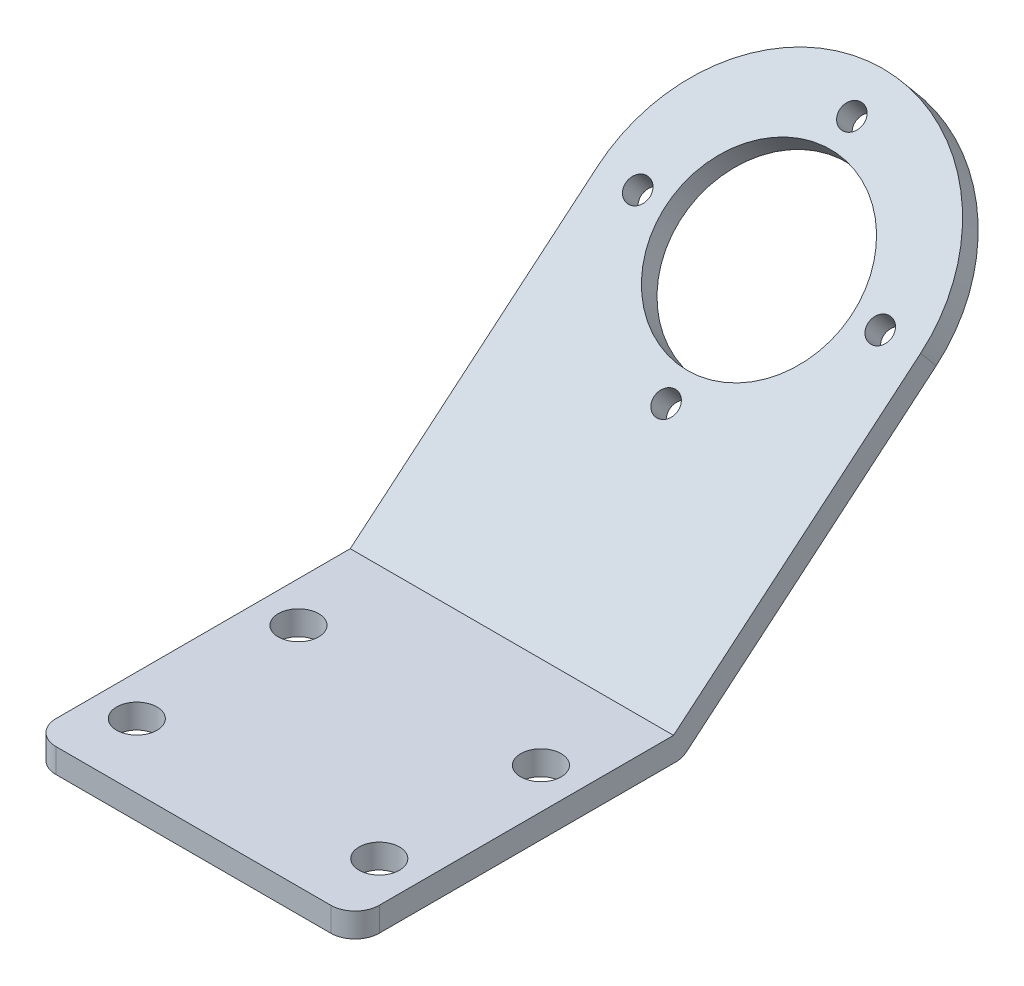
ISO-10303-21;
HEADER;
FILE_DESCRIPTION(('STEP AP214'),'2;1');
FILE_NAME('part.step','',(''),(''),'','','');
FILE_SCHEMA(('AUTOMOTIVE_DESIGN { 1 0 10303 214 1 1 1 1 }'));
ENDSEC;
DATA;
#1=APPLICATION_CONTEXT('core data for automotive mechanical design processes');
#2=APPLICATION_PROTOCOL_DEFINITION('international standard','automotive_design',2000,#1);
#3=PRODUCT_CONTEXT('',#1,'mechanical');
#4=PRODUCT('Part','Part','',(#3));
#5=PRODUCT_RELATED_PRODUCT_CATEGORY('part','',(#4));
#6=PRODUCT_DEFINITION_FORMATION('','',#4);
#7=PRODUCT_DEFINITION_CONTEXT('part definition',#1,'design');
#8=PRODUCT_DEFINITION('design','',#6,#7);
#9=PRODUCT_DEFINITION_SHAPE('','',#8);
#10=(LENGTH_UNIT() NAMED_UNIT(*) SI_UNIT(.MILLI.,.METRE.));
#11=(NAMED_UNIT(*) PLANE_ANGLE_UNIT() SI_UNIT($,.RADIAN.));
#12=(NAMED_UNIT(*) SI_UNIT($,.STERADIAN.) SOLID_ANGLE_UNIT());
#13=UNCERTAINTY_MEASURE_WITH_UNIT(LENGTH_MEASURE(1.E-05),#10,'distance_accuracy_value','');
#14=(GEOMETRIC_REPRESENTATION_CONTEXT(3) GLOBAL_UNCERTAINTY_ASSIGNED_CONTEXT((#13)) GLOBAL_UNIT_ASSIGNED_CONTEXT((#10,
#11,#12)) REPRESENTATION_CONTEXT('',''));
#15=CARTESIAN_POINT('',(0.,0.,0.));
#16=DIRECTION('',(0.,0.,1.));
#17=DIRECTION('',(1.,0.,0.));
#18=AXIS2_PLACEMENT_3D('',#15,#16,#17);
#19=CARTESIAN_POINT('',(40.,0.,39.4080892972013));
#20=DIRECTION('',(0.,0.,-1.));
#21=DIRECTION('',(-1.,0.,0.));
#22=AXIS2_PLACEMENT_3D('',#19,#20,#21);
#23=PLANE('',#22);
#24=DIRECTION('',(-1.,0.,0.));
#25=VECTOR('',#24,1.);
#26=CARTESIAN_POINT('',(40.,0.,39.4080892972013));
#27=LINE('',#26,#25);
#28=CARTESIAN_POINT('',(37.,0.,39.4080892972013));
#29=VERTEX_POINT('',#28);
#30=CARTESIAN_POINT('',(3.,0.,39.4080892972013));
#31=VERTEX_POINT('',#30);
#32=EDGE_CURVE('E141',#29,#31,#27,.T.);
#33=ORIENTED_EDGE('',*,*,#32,.T.);
#34=DIRECTION('',(0.,-1.,0.));
#35=VECTOR('',#34,1.);
#36=CARTESIAN_POINT('',(3.,0.,39.4080892972013));
#37=LINE('',#36,#35);
#38=CARTESIAN_POINT('',(3.,-3.,39.4080892972013));
#39=VERTEX_POINT('',#38);
#40=EDGE_CURVE('E181',#31,#39,#37,.T.);
#41=ORIENTED_EDGE('',*,*,#40,.T.);
#42=DIRECTION('',(-1.,0.,0.));
#43=VECTOR('',#42,1.);
#44=CARTESIAN_POINT('',(40.,-3.,39.4080892972013));
#45=LINE('',#44,#43);
#46=CARTESIAN_POINT('',(37.,-3.,39.4080892972013));
#47=VERTEX_POINT('',#46);
#48=EDGE_CURVE('E140',#47,#39,#45,.T.);
#49=ORIENTED_EDGE('',*,*,#48,.F.);
#50=DIRECTION('',(0.,-1.,0.));
#51=VECTOR('',#50,1.);
#52=CARTESIAN_POINT('',(37.,0.,39.4080892972013));
#53=LINE('',#52,#51);
#54=EDGE_CURVE('E176',#47,#29,#53,.F.);
#55=ORIENTED_EDGE('',*,*,#54,.T.);
#56=EDGE_LOOP('',(#33,#41,#49,#55));
#57=FACE_BOUND('',#56,.T.);
#58=ADVANCED_FACE('F39',(#57),#23,.F.);
#59=CARTESIAN_POINT('',(40.,-3.,-1.09191070279867));
#60=DIRECTION('',(0.,1.,0.));
#61=DIRECTION('',(0.,0.,1.));
#62=AXIS2_PLACEMENT_3D('',#59,#60,#61);
#63=PLANE('',#62);
#64=CARTESIAN_POINT('',(35.,-3.,31.4080892972013));
#65=DIRECTION('',(0.,1.,0.));
#66=DIRECTION('',(0.,0.,1.));
#67=AXIS2_PLACEMENT_3D('',#64,#65,#66);
#68=CIRCLE('',#67,2.5);
#69=CARTESIAN_POINT('',(35.,-3.,33.9080892972013));
#70=VERTEX_POINT('',#69);
#71=EDGE_CURVE('E302',#70,#70,#68,.T.);
#72=ORIENTED_EDGE('',*,*,#71,.T.);
#73=EDGE_LOOP('',(#72));
#74=FACE_BOUND('',#73,.T.);
#75=CARTESIAN_POINT('',(35.,-3.,11.4080892972013));
#76=DIRECTION('',(0.,1.,0.));
#77=DIRECTION('',(0.,0.,1.));
#78=AXIS2_PLACEMENT_3D('',#75,#76,#77);
#79=CIRCLE('',#78,2.49999999895199);
#80=CARTESIAN_POINT('',(35.,-3.,13.9080892961533));
#81=VERTEX_POINT('',#80);
#82=EDGE_CURVE('E294',#81,#81,#79,.T.);
#83=ORIENTED_EDGE('',*,*,#82,.T.);
#84=EDGE_LOOP('',(#83));
#85=FACE_BOUND('',#84,.T.);
#86=CARTESIAN_POINT('',(5.,-3.,11.4080892972013));
#87=DIRECTION('',(0.,1.,0.));
#88=DIRECTION('',(0.,0.,1.));
#89=AXIS2_PLACEMENT_3D('',#86,#87,#88);
#90=CIRCLE('',#89,2.49999999895199);
#91=CARTESIAN_POINT('',(5.,-3.,13.9080892961533));
#92=VERTEX_POINT('',#91);
#93=EDGE_CURVE('E286',#92,#92,#90,.T.);
#94=ORIENTED_EDGE('',*,*,#93,.T.);
#95=EDGE_LOOP('',(#94));
#96=FACE_BOUND('',#95,.T.);
#97=CARTESIAN_POINT('',(5.,-3.,31.4080892972013));
#98=DIRECTION('',(0.,1.,0.));
#99=DIRECTION('',(0.,0.,1.));
#100=AXIS2_PLACEMENT_3D('',#97,#98,#99);
#101=CIRCLE('',#100,2.5);
#102=CARTESIAN_POINT('',(5.,-3.,33.9080892972013));
#103=VERTEX_POINT('',#102);
#104=EDGE_CURVE('E158',#103,#103,#101,.T.);
#105=ORIENTED_EDGE('',*,*,#104,.T.);
#106=EDGE_LOOP('',(#105));
#107=FACE_BOUND('',#106,.T.);
#108=DIRECTION('',(0.,0.,-1.));
#109=VECTOR('',#108,1.);
#110=CARTESIAN_POINT('',(0.,-3.,-1.09191070279867));
#111=LINE('',#110,#109);
#112=CARTESIAN_POINT('',(0.,-3.,36.4080892972013));
#113=VERTEX_POINT('',#112);
#114=CARTESIAN_POINT('',(0.,-3.,-0.363970234266271));
#115=VERTEX_POINT('',#114);
#116=EDGE_CURVE('E154',#113,#115,#111,.T.);
#117=ORIENTED_EDGE('',*,*,#116,.T.);
#118=DIRECTION('',(-1.,0.,0.));
#119=VECTOR('',#118,1.);
#120=CARTESIAN_POINT('',(40.,-3.,-0.363970234266271));
#121=LINE('',#120,#119);
#122=CARTESIAN_POINT('',(40.,-3.,-0.363970234266271));
#123=VERTEX_POINT('',#122);
#124=EDGE_CURVE('E48',#115,#123,#121,.F.);
#125=ORIENTED_EDGE('',*,*,#124,.T.);
#126=DIRECTION('',(0.,0.,-1.));
#127=VECTOR('',#126,1.);
#128=CARTESIAN_POINT('',(40.,-3.,39.4080892972013));
#129=LINE('',#128,#127);
#130=CARTESIAN_POINT('',(40.,-3.,36.4080892972013));
#131=VERTEX_POINT('',#130);
#132=EDGE_CURVE('E165',#131,#123,#129,.T.);
#133=ORIENTED_EDGE('',*,*,#132,.F.);
#134=CARTESIAN_POINT('',(37.,-3.,36.4080892972013));
#135=DIRECTION('',(0.,1.,0.));
#136=DIRECTION('',(0.,0.,1.));
#137=AXIS2_PLACEMENT_3D('',#134,#135,#136);
#138=CIRCLE('',#137,3.);
#139=EDGE_CURVE('E173',#131,#47,#138,.F.);
#140=ORIENTED_EDGE('',*,*,#139,.T.);
#141=ORIENTED_EDGE('',*,*,#48,.T.);
#142=CARTESIAN_POINT('',(3.,-3.,36.4080892972013));
#143=DIRECTION('',(0.,1.,0.));
#144=DIRECTION('',(0.,0.,1.));
#145=AXIS2_PLACEMENT_3D('',#142,#143,#144);
#146=CIRCLE('',#145,3.);
#147=EDGE_CURVE('E185',#39,#113,#146,.F.);
#148=ORIENTED_EDGE('',*,*,#147,.T.);
#149=EDGE_LOOP('',(#117,#125,#133,#140,#141,#148));
#150=FACE_BOUND('',#149,.T.);
#151=ADVANCED_FACE('F251',(#74,#85,#96,#107,#150),#63,.F.);
#152=CARTESIAN_POINT('',(40.,36.210044190879,-47.8206217330563));
#153=DIRECTION('',(0.,0.766044443118977,0.64278760968654));
#154=DIRECTION('',(0.,-0.64278760968654,0.766044443118977));
#155=AXIS2_PLACEMENT_3D('',#152,#153,#154);
#156=PLANE('',#155);
#157=CARTESIAN_POINT('',(20.,13.7124778518501,-21.0090662238921));
#158=DIRECTION('',(0.,0.766044443118977,0.64278760968654));
#159=DIRECTION('',(0.,-0.64278760968654,0.766044443118977));
#160=AXIS2_PLACEMENT_3D('',#157,#158,#159);
#161=CIRCLE('',#160,1.5);
#162=CARTESIAN_POINT('',(20.,12.7482964373203,-19.8599995592136));
#163=VERTEX_POINT('',#162);
#164=EDGE_CURVE('E342',#163,#163,#161,.T.);
#165=ORIENTED_EDGE('',*,*,#164,.T.);
#166=EDGE_LOOP('',(#165));
#167=FACE_BOUND('',#166,.T.);
#168=CARTESIAN_POINT('',(5.00000000000002,23.3542919971482,-32.4997328706767));
#169=DIRECTION('',(0.,0.766044443118977,0.64278760968654));
#170=DIRECTION('',(0.,-0.64278760968654,0.766044443118977));
#171=AXIS2_PLACEMENT_3D('',#168,#169,#170);
#172=CIRCLE('',#171,1.5);
#173=CARTESIAN_POINT('',(5.00000000000002,22.3901105826183,-31.3506662059983));
#174=VERTEX_POINT('',#173);
#175=EDGE_CURVE('E334',#174,#174,#172,.T.);
#176=ORIENTED_EDGE('',*,*,#175,.T.);
#177=EDGE_LOOP('',(#176));
#178=FACE_BOUND('',#177,.T.);
#179=CARTESIAN_POINT('',(35.,23.3542919971482,-32.4997328706767));
#180=DIRECTION('',(0.,0.766044443118977,0.64278760968654));
#181=DIRECTION('',(0.,-0.64278760968654,0.766044443118977));
#182=AXIS2_PLACEMENT_3D('',#179,#180,#181);
#183=CIRCLE('',#182,1.50000000000001);
#184=CARTESIAN_POINT('',(35.,22.3901105826183,-31.3506662059983));
#185=VERTEX_POINT('',#184);
#186=EDGE_CURVE('E326',#185,#185,#183,.T.);
#187=ORIENTED_EDGE('',*,*,#186,.T.);
#188=EDGE_LOOP('',(#187));
#189=FACE_BOUND('',#188,.T.);
#190=CARTESIAN_POINT('',(20.,32.9961061424462,-43.9903995174614));
#191=DIRECTION('',(0.,0.766044443118977,0.64278760968654));
#192=DIRECTION('',(0.,-0.64278760968654,0.766044443118977));
#193=AXIS2_PLACEMENT_3D('',#190,#191,#192);
#194=CIRCLE('',#193,1.5);
#195=CARTESIAN_POINT('',(20.,32.0319247279164,-42.8413328527829));
#196=VERTEX_POINT('',#195);
#197=EDGE_CURVE('E318',#196,#196,#194,.T.);
#198=ORIENTED_EDGE('',*,*,#197,.T.);
#199=EDGE_LOOP('',(#198));
#200=FACE_BOUND('',#199,.T.);
#201=CARTESIAN_POINT('',(20.,23.3542919971482,-32.4997328706767));
#202=DIRECTION('',(0.,0.766044443118977,0.64278760968654));
#203=DIRECTION('',(0.,-0.64278760968654,0.766044443118977));
#204=AXIS2_PLACEMENT_3D('',#201,#202,#203);
#205=CIRCLE('',#204,11.55);
#206=CARTESIAN_POINT('',(20.,15.9300951052686,-23.6519195526525));
#207=VERTEX_POINT('',#206);
#208=EDGE_CURVE('E310',#207,#207,#205,.T.);
#209=ORIENTED_EDGE('',*,*,#208,.T.);
#210=EDGE_LOOP('',(#209));
#211=FACE_BOUND('',#210,.T.);
#212=DIRECTION('',(0.,0.64278760968654,-0.766044443118977));
#213=VECTOR('',#212,1.);
#214=CARTESIAN_POINT('',(40.,36.210044190879,-47.8206217330563));
#215=LINE('',#214,#213);
#216=CARTESIAN_POINT('',(40.,-2.53208888623795,-1.64954545363936));
#217=VERTEX_POINT('',#216);
#218=CARTESIAN_POINT('',(40.,23.3542919971482,-32.4997328706767));
#219=VERTEX_POINT('',#218);
#220=EDGE_CURVE('E129',#217,#219,#215,.T.);
#221=ORIENTED_EDGE('',*,*,#220,.F.);
#222=DIRECTION('',(-1.,0.,0.));
#223=VECTOR('',#222,1.);
#224=CARTESIAN_POINT('',(40.,-2.53208888623796,-1.64954545363934));
#225=LINE('',#224,#223);
#226=CARTESIAN_POINT('',(0.,-2.53208888623795,-1.64954545363936));
#227=VERTEX_POINT('',#226);
#228=EDGE_CURVE('E217',#217,#227,#225,.T.);
#229=ORIENTED_EDGE('',*,*,#228,.T.);
#230=DIRECTION('',(0.,0.64278760968654,-0.766044443118977));
#231=VECTOR('',#230,1.);
#232=CARTESIAN_POINT('',(0.,36.210044190879,-47.8206217330563));
#233=LINE('',#232,#231);
#234=CARTESIAN_POINT('',(0.,23.3542919971482,-32.4997328706767));
#235=VERTEX_POINT('',#234);
#236=EDGE_CURVE('E157',#227,#235,#233,.T.);
#237=ORIENTED_EDGE('',*,*,#236,.T.);
#238=CARTESIAN_POINT('',(20.,23.3542919971482,-32.4997328706767));
#239=DIRECTION('',(0.,0.766044443118977,0.64278760968654));
#240=DIRECTION('',(0.,-0.64278760968654,0.766044443118977));
#241=AXIS2_PLACEMENT_3D('',#238,#239,#240);
#242=CIRCLE('',#241,20.);
#243=CARTESIAN_POINT('',(20.,36.210044190879,-47.8206217330563));
#244=VERTEX_POINT('',#243);
#245=EDGE_CURVE('E205',#235,#244,#242,.F.);
#246=ORIENTED_EDGE('',*,*,#245,.T.);
#247=CARTESIAN_POINT('',(20.,23.3542919971482,-32.4997328706767));
#248=DIRECTION('',(0.,0.766044443118977,0.64278760968654));
#249=DIRECTION('',(0.,-0.64278760968654,0.766044443118977));
#250=AXIS2_PLACEMENT_3D('',#247,#248,#249);
#251=CIRCLE('',#250,20.);
#252=EDGE_CURVE('E213',#244,#219,#251,.F.);
#253=ORIENTED_EDGE('',*,*,#252,.T.);
#254=EDGE_LOOP('',(#221,#229,#237,#246,#253));
#255=FACE_BOUND('',#254,.T.);
#256=ADVANCED_FACE('F226',(#167,#178,#189,#200,#211,#255),#156,.F.);
#257=CARTESIAN_POINT('',(40.,0.,0.));
#258=DIRECTION('',(0.,-0.766044443118977,-0.64278760968654));
#259=DIRECTION('',(0.,0.64278760968654,-0.766044443118977));
#260=AXIS2_PLACEMENT_3D('',#257,#258,#259);
#261=PLANE('',#260);
#262=CARTESIAN_POINT('',(20.,16.010611181207,-19.0807033948324));
#263=DIRECTION('',(0.,0.766044443118977,0.64278760968654));
#264=DIRECTION('',(0.,0.64278760968654,-0.766044443118977));
#265=AXIS2_PLACEMENT_3D('',#262,#263,#264);
#266=CIRCLE('',#265,1.5);
#267=CARTESIAN_POINT('',(20.,16.9747925957368,-20.2297700595109));
#268=VERTEX_POINT('',#267);
#269=EDGE_CURVE('E346',#268,#268,#266,.T.);
#270=ORIENTED_EDGE('',*,*,#269,.F.);
#271=EDGE_LOOP('',(#270));
#272=FACE_BOUND('',#271,.T.);
#273=CARTESIAN_POINT('',(5.00000000000002,25.6524253265051,-30.5713700416171));
#274=DIRECTION('',(0.,0.766044443118977,0.64278760968654));
#275=DIRECTION('',(0.,-0.64278760968654,0.766044443118977));
#276=AXIS2_PLACEMENT_3D('',#273,#274,#275);
#277=CIRCLE('',#276,1.5);
#278=CARTESIAN_POINT('',(5.00000000000002,24.6882439119753,-29.4223033769386));
#279=VERTEX_POINT('',#278);
#280=EDGE_CURVE('E338',#279,#279,#277,.T.);
#281=ORIENTED_EDGE('',*,*,#280,.F.);
#282=EDGE_LOOP('',(#281));
#283=FACE_BOUND('',#282,.T.);
#284=CARTESIAN_POINT('',(35.,25.6524253265051,-30.5713700416171));
#285=DIRECTION('',(0.,0.766044443118977,0.64278760968654));
#286=DIRECTION('',(0.,0.64278760968654,-0.766044443118977));
#287=AXIS2_PLACEMENT_3D('',#284,#285,#286);
#288=CIRCLE('',#287,1.50000000000001);
#289=CARTESIAN_POINT('',(35.,26.6166067410349,-31.7204367062956));
#290=VERTEX_POINT('',#289);
#291=EDGE_CURVE('E330',#290,#290,#288,.T.);
#292=ORIENTED_EDGE('',*,*,#291,.F.);
#293=EDGE_LOOP('',(#292));
#294=FACE_BOUND('',#293,.T.);
#295=CARTESIAN_POINT('',(20.,35.2942394718032,-42.0620366884017));
#296=DIRECTION('',(0.,0.766044443118977,0.64278760968654));
#297=DIRECTION('',(0.,-0.64278760968654,0.766044443118977));
#298=AXIS2_PLACEMENT_3D('',#295,#296,#297);
#299=CIRCLE('',#298,1.5);
#300=CARTESIAN_POINT('',(20.,34.3300580572734,-40.9129700237233));
#301=VERTEX_POINT('',#300);
#302=EDGE_CURVE('E322',#301,#301,#299,.T.);
#303=ORIENTED_EDGE('',*,*,#302,.F.);
#304=EDGE_LOOP('',(#303));
#305=FACE_BOUND('',#304,.T.);
#306=CARTESIAN_POINT('',(20.,25.6524253265051,-30.5713700416171));
#307=DIRECTION('',(0.,0.766044443118977,0.64278760968654));
#308=DIRECTION('',(0.,-0.64278760968654,0.766044443118977));
#309=AXIS2_PLACEMENT_3D('',#306,#307,#308);
#310=CIRCLE('',#309,11.55);
#311=CARTESIAN_POINT('',(20.,18.2282284346256,-21.7235567235929));
#312=VERTEX_POINT('',#311);
#313=EDGE_CURVE('E314',#312,#312,#310,.T.);
#314=ORIENTED_EDGE('',*,*,#313,.F.);
#315=EDGE_LOOP('',(#314));
#316=FACE_BOUND('',#315,.T.);
#317=DIRECTION('',(0.,-0.64278760968654,0.766044443118977));
#318=VECTOR('',#317,1.);
#319=CARTESIAN_POINT('',(40.,0.,0.));
#320=LINE('',#319,#318);
#321=CARTESIAN_POINT('',(40.,25.6524253265051,-30.5713700416171));
#322=VERTEX_POINT('',#321);
#323=CARTESIAN_POINT('',(40.,0.,0.));
#324=VERTEX_POINT('',#323);
#325=EDGE_CURVE('E118',#322,#324,#320,.T.);
#326=ORIENTED_EDGE('',*,*,#325,.F.);
#327=CARTESIAN_POINT('',(20.,25.6524253265051,-30.5713700416171));
#328=DIRECTION('',(0.,-0.766044443118977,-0.64278760968654));
#329=DIRECTION('',(0.,0.64278760968654,-0.766044443118977));
#330=AXIS2_PLACEMENT_3D('',#327,#328,#329);
#331=CIRCLE('',#330,20.);
#332=CARTESIAN_POINT('',(20.,38.5081775202359,-45.8922589039966));
#333=VERTEX_POINT('',#332);
#334=EDGE_CURVE('E210',#322,#333,#331,.F.);
#335=ORIENTED_EDGE('',*,*,#334,.T.);
#336=CARTESIAN_POINT('',(20.,25.6524253265051,-30.5713700416171));
#337=DIRECTION('',(0.,-0.766044443118977,-0.64278760968654));
#338=DIRECTION('',(0.,0.64278760968654,-0.766044443118977));
#339=AXIS2_PLACEMENT_3D('',#336,#337,#338);
#340=CIRCLE('',#339,20.);
#341=CARTESIAN_POINT('',(0.,25.6524253265051,-30.5713700416171));
#342=VERTEX_POINT('',#341);
#343=EDGE_CURVE('E198',#333,#342,#340,.F.);
#344=ORIENTED_EDGE('',*,*,#343,.T.);
#345=DIRECTION('',(0.,-0.64278760968654,0.766044443118977));
#346=VECTOR('',#345,1.);
#347=CARTESIAN_POINT('',(0.,0.,0.));
#348=LINE('',#347,#346);
#349=CARTESIAN_POINT('',(0.,0.,0.));
#350=VERTEX_POINT('',#349);
#351=EDGE_CURVE('E135',#342,#350,#348,.T.);
#352=ORIENTED_EDGE('',*,*,#351,.T.);
#353=DIRECTION('',(-1.,0.,0.));
#354=VECTOR('',#353,1.);
#355=CARTESIAN_POINT('',(40.,0.,0.));
#356=LINE('',#355,#354);
#357=EDGE_CURVE('E132',#324,#350,#356,.T.);
#358=ORIENTED_EDGE('',*,*,#357,.F.);
#359=EDGE_LOOP('',(#326,#335,#344,#352,#358));
#360=FACE_BOUND('',#359,.T.);
#361=ADVANCED_FACE('F133',(#272,#283,#294,#305,#316,#360),#261,.F.);
#362=CARTESIAN_POINT('',(40.,0.,39.4080892972013));
#363=DIRECTION('',(0.,-1.,0.));
#364=DIRECTION('',(0.,0.,-1.));
#365=AXIS2_PLACEMENT_3D('',#362,#363,#364);
#366=PLANE('',#365);
#367=CARTESIAN_POINT('',(35.,0.,31.4080892972013));
#368=DIRECTION('',(0.,1.,0.));
#369=DIRECTION('',(0.,0.,1.));
#370=AXIS2_PLACEMENT_3D('',#367,#368,#369);
#371=CIRCLE('',#370,2.5);
#372=CARTESIAN_POINT('',(35.,0.,33.9080892972013));
#373=VERTEX_POINT('',#372);
#374=EDGE_CURVE('E306',#373,#373,#371,.T.);
#375=ORIENTED_EDGE('',*,*,#374,.F.);
#376=EDGE_LOOP('',(#375));
#377=FACE_BOUND('',#376,.T.);
#378=CARTESIAN_POINT('',(35.,0.,11.4080892972013));
#379=DIRECTION('',(0.,1.,0.));
#380=DIRECTION('',(0.,0.,1.));
#381=AXIS2_PLACEMENT_3D('',#378,#379,#380);
#382=CIRCLE('',#381,2.49999999895199);
#383=CARTESIAN_POINT('',(35.,0.,13.9080892961533));
#384=VERTEX_POINT('',#383);
#385=EDGE_CURVE('E298',#384,#384,#382,.T.);
#386=ORIENTED_EDGE('',*,*,#385,.F.);
#387=EDGE_LOOP('',(#386));
#388=FACE_BOUND('',#387,.T.);
#389=CARTESIAN_POINT('',(5.,0.,11.4080892972013));
#390=DIRECTION('',(0.,1.,0.));
#391=DIRECTION('',(0.,0.,1.));
#392=AXIS2_PLACEMENT_3D('',#389,#390,#391);
#393=CIRCLE('',#392,2.49999999895199);
#394=CARTESIAN_POINT('',(5.,0.,13.9080892961533));
#395=VERTEX_POINT('',#394);
#396=EDGE_CURVE('E290',#395,#395,#393,.T.);
#397=ORIENTED_EDGE('',*,*,#396,.F.);
#398=EDGE_LOOP('',(#397));
#399=FACE_BOUND('',#398,.T.);
#400=CARTESIAN_POINT('',(5.,0.,31.4080892972013));
#401=DIRECTION('',(0.,1.,0.));
#402=DIRECTION('',(0.,0.,1.));
#403=AXIS2_PLACEMENT_3D('',#400,#401,#402);
#404=CIRCLE('',#403,2.5);
#405=CARTESIAN_POINT('',(5.,0.,33.9080892972013));
#406=VERTEX_POINT('',#405);
#407=EDGE_CURVE('E282',#406,#406,#404,.T.);
#408=ORIENTED_EDGE('',*,*,#407,.F.);
#409=EDGE_LOOP('',(#408));
#410=FACE_BOUND('',#409,.T.);
#411=DIRECTION('',(0.,0.,1.));
#412=VECTOR('',#411,1.);
#413=CARTESIAN_POINT('',(0.,0.,39.4080892972013));
#414=LINE('',#413,#412);
#415=CARTESIAN_POINT('',(0.,0.,36.4080892972013));
#416=VERTEX_POINT('',#415);
#417=EDGE_CURVE('E163',#350,#416,#414,.T.);
#418=ORIENTED_EDGE('',*,*,#417,.T.);
#419=CARTESIAN_POINT('',(3.,0.,36.4080892972013));
#420=DIRECTION('',(0.,-1.,0.));
#421=DIRECTION('',(0.,0.,-1.));
#422=AXIS2_PLACEMENT_3D('',#419,#420,#421);
#423=CIRCLE('',#422,3.);
#424=EDGE_CURVE('E191',#416,#31,#423,.F.);
#425=ORIENTED_EDGE('',*,*,#424,.T.);
#426=ORIENTED_EDGE('',*,*,#32,.F.);
#427=CARTESIAN_POINT('',(37.,0.,36.4080892972013));
#428=DIRECTION('',(0.,-1.,0.));
#429=DIRECTION('',(0.,0.,-1.));
#430=AXIS2_PLACEMENT_3D('',#427,#428,#429);
#431=CIRCLE('',#430,3.);
#432=CARTESIAN_POINT('',(40.,0.,36.4080892972013));
#433=VERTEX_POINT('',#432);
#434=EDGE_CURVE('E146',#29,#433,#431,.F.);
#435=ORIENTED_EDGE('',*,*,#434,.T.);
#436=DIRECTION('',(0.,0.,1.));
#437=VECTOR('',#436,1.);
#438=CARTESIAN_POINT('',(40.,0.,39.4080892972013));
#439=LINE('',#438,#437);
#440=EDGE_CURVE('E123',#324,#433,#439,.T.);
#441=ORIENTED_EDGE('',*,*,#440,.F.);
#442=ORIENTED_EDGE('',*,*,#357,.T.);
#443=EDGE_LOOP('',(#418,#425,#426,#435,#441,#442));
#444=FACE_BOUND('',#443,.T.);
#445=ADVANCED_FACE('F143',(#377,#388,#399,#410,#444),#366,.F.);
#446=CARTESIAN_POINT('',(40.,0.,0.));
#447=DIRECTION('',(1.,0.,0.));
#448=DIRECTION('',(0.,0.,-1.));
#449=AXIS2_PLACEMENT_3D('',#446,#447,#448);
#450=PLANE('',#449);
#451=ORIENTED_EDGE('',*,*,#132,.T.);
#452=CARTESIAN_POINT('',(40.,-1.,-0.363970234266271));
#453=DIRECTION('',(1.,0.,0.));
#454=DIRECTION('',(0.,0.,-1.));
#455=AXIS2_PLACEMENT_3D('',#452,#453,#454);
#456=CIRCLE('',#455,2.);
#457=EDGE_CURVE('E11',#123,#217,#456,.T.);
#458=ORIENTED_EDGE('',*,*,#457,.T.);
#459=ORIENTED_EDGE('',*,*,#220,.T.);
#460=DIRECTION('',(0.,0.766044443118976,0.642787609686541));
#461=VECTOR('',#460,1.);
#462=CARTESIAN_POINT('',(40.,25.6524253265051,-30.5713700416171));
#463=LINE('',#462,#461);
#464=EDGE_CURVE('E126',#219,#322,#463,.T.);
#465=ORIENTED_EDGE('',*,*,#464,.T.);
#466=ORIENTED_EDGE('',*,*,#325,.T.);
#467=ORIENTED_EDGE('',*,*,#440,.T.);
#468=DIRECTION('',(0.,-1.,0.));
#469=VECTOR('',#468,1.);
#470=CARTESIAN_POINT('',(40.,-3.,36.4080892972013));
#471=LINE('',#470,#469);
#472=EDGE_CURVE('E170',#433,#131,#471,.T.);
#473=ORIENTED_EDGE('',*,*,#472,.T.);
#474=EDGE_LOOP('',(#451,#458,#459,#465,#466,#467,#473));
#475=FACE_BOUND('',#474,.T.);
#476=ADVANCED_FACE('F120',(#475),#450,.T.);
#477=CARTESIAN_POINT('',(0.,0.,0.));
#478=DIRECTION('',(1.,0.,0.));
#479=DIRECTION('',(0.,0.,-1.));
#480=AXIS2_PLACEMENT_3D('',#477,#478,#479);
#481=PLANE('',#480);
#482=ORIENTED_EDGE('',*,*,#236,.F.);
#483=CARTESIAN_POINT('',(0.,-1.,-0.363970234266271));
#484=DIRECTION('',(1.,0.,0.));
#485=DIRECTION('',(0.,0.,-1.));
#486=AXIS2_PLACEMENT_3D('',#483,#484,#485);
#487=CIRCLE('',#486,2.);
#488=EDGE_CURVE('E62',#227,#115,#487,.F.);
#489=ORIENTED_EDGE('',*,*,#488,.T.);
#490=ORIENTED_EDGE('',*,*,#116,.F.);
#491=DIRECTION('',(0.,-1.,0.));
#492=VECTOR('',#491,1.);
#493=CARTESIAN_POINT('',(0.,0.,36.4080892972013));
#494=LINE('',#493,#492);
#495=EDGE_CURVE('E188',#113,#416,#494,.F.);
#496=ORIENTED_EDGE('',*,*,#495,.T.);
#497=ORIENTED_EDGE('',*,*,#417,.F.);
#498=ORIENTED_EDGE('',*,*,#351,.F.);
#499=DIRECTION('',(0.,0.766044443118976,0.642787609686541));
#500=VECTOR('',#499,1.);
#501=CARTESIAN_POINT('',(0.,25.6524253265052,-30.5713700416171));
#502=LINE('',#501,#500);
#503=EDGE_CURVE('E201',#342,#235,#502,.F.);
#504=ORIENTED_EDGE('',*,*,#503,.T.);
#505=EDGE_LOOP('',(#482,#489,#490,#496,#497,#498,#504));
#506=FACE_BOUND('',#505,.T.);
#507=ADVANCED_FACE('F229',(#506),#481,.F.);
#508=CARTESIAN_POINT('',(5.,-40.,31.4080892972013));
#509=DIRECTION('',(0.,1.,0.));
#510=DIRECTION('',(0.,0.,1.));
#511=AXIS2_PLACEMENT_3D('',#508,#509,#510);
#512=CYLINDRICAL_SURFACE('',#511,2.5);
#513=ORIENTED_EDGE('',*,*,#407,.T.);
#514=EDGE_LOOP('',(#513));
#515=FACE_BOUND('',#514,.T.);
#516=ORIENTED_EDGE('',*,*,#104,.F.);
#517=EDGE_LOOP('',(#516));
#518=FACE_BOUND('',#517,.T.);
#519=ADVANCED_FACE('F378',(#515,#518),#512,.F.);
#520=CARTESIAN_POINT('',(5.,-40.,11.4080892972013));
#521=DIRECTION('',(0.,1.,0.));
#522=DIRECTION('',(0.,0.,1.));
#523=AXIS2_PLACEMENT_3D('',#520,#521,#522);
#524=CYLINDRICAL_SURFACE('',#523,2.49999999895199);
#525=ORIENTED_EDGE('',*,*,#396,.T.);
#526=EDGE_LOOP('',(#525));
#527=FACE_BOUND('',#526,.T.);
#528=ORIENTED_EDGE('',*,*,#93,.F.);
#529=EDGE_LOOP('',(#528));
#530=FACE_BOUND('',#529,.T.);
#531=ADVANCED_FACE('F383',(#527,#530),#524,.F.);
#532=CARTESIAN_POINT('',(35.,-40.,11.4080892972013));
#533=DIRECTION('',(0.,1.,0.));
#534=DIRECTION('',(0.,0.,1.));
#535=AXIS2_PLACEMENT_3D('',#532,#533,#534);
#536=CYLINDRICAL_SURFACE('',#535,2.49999999895199);
#537=ORIENTED_EDGE('',*,*,#385,.T.);
#538=EDGE_LOOP('',(#537));
#539=FACE_BOUND('',#538,.T.);
#540=ORIENTED_EDGE('',*,*,#82,.F.);
#541=EDGE_LOOP('',(#540));
#542=FACE_BOUND('',#541,.T.);
#543=ADVANCED_FACE('F387',(#539,#542),#536,.F.);
#544=CARTESIAN_POINT('',(35.,-40.,31.4080892972013));
#545=DIRECTION('',(0.,1.,0.));
#546=DIRECTION('',(0.,0.,1.));
#547=AXIS2_PLACEMENT_3D('',#544,#545,#546);
#548=CYLINDRICAL_SURFACE('',#547,2.5);
#549=ORIENTED_EDGE('',*,*,#374,.T.);
#550=EDGE_LOOP('',(#549));
#551=FACE_BOUND('',#550,.T.);
#552=ORIENTED_EDGE('',*,*,#71,.F.);
#553=EDGE_LOOP('',(#552));
#554=FACE_BOUND('',#553,.T.);
#555=ADVANCED_FACE('F264',(#551,#554),#548,.F.);
#556=CARTESIAN_POINT('',(37.,0.,36.4080892972013));
#557=DIRECTION('',(0.,1.,0.));
#558=DIRECTION('',(0.,0.,1.));
#559=AXIS2_PLACEMENT_3D('',#556,#557,#558);
#560=CYLINDRICAL_SURFACE('',#559,3.);
#561=ORIENTED_EDGE('',*,*,#434,.F.);
#562=ORIENTED_EDGE('',*,*,#54,.F.);
#563=ORIENTED_EDGE('',*,*,#139,.F.);
#564=ORIENTED_EDGE('',*,*,#472,.F.);
#565=EDGE_LOOP('',(#561,#562,#563,#564));
#566=FACE_BOUND('',#565,.T.);
#567=ADVANCED_FACE('F261',(#566),#560,.T.);
#568=CARTESIAN_POINT('',(3.,0.,36.4080892972013));
#569=DIRECTION('',(0.,-1.,0.));
#570=DIRECTION('',(0.,0.,-1.));
#571=AXIS2_PLACEMENT_3D('',#568,#569,#570);
#572=CYLINDRICAL_SURFACE('',#571,3.);
#573=ORIENTED_EDGE('',*,*,#424,.F.);
#574=ORIENTED_EDGE('',*,*,#495,.F.);
#575=ORIENTED_EDGE('',*,*,#147,.F.);
#576=ORIENTED_EDGE('',*,*,#40,.F.);
#577=EDGE_LOOP('',(#573,#574,#575,#576));
#578=FACE_BOUND('',#577,.T.);
#579=ADVANCED_FACE('F248',(#578),#572,.T.);
#580=CARTESIAN_POINT('',(20.,25.6524253265051,-30.5713700416171));
#581=DIRECTION('',(0.,0.766044443118976,0.642787609686541));
#582=DIRECTION('',(0.,-0.642787609686541,0.766044443118976));
#583=AXIS2_PLACEMENT_3D('',#580,#581,#582);
#584=CYLINDRICAL_SURFACE('',#583,20.);
#585=ORIENTED_EDGE('',*,*,#245,.F.);
#586=ORIENTED_EDGE('',*,*,#503,.F.);
#587=ORIENTED_EDGE('',*,*,#343,.F.);
#588=DIRECTION('',(0.,0.766044443118976,0.642787609686541));
#589=VECTOR('',#588,1.);
#590=CARTESIAN_POINT('',(20.,38.5081775202359,-45.8922589039966));
#591=LINE('',#590,#589);
#592=EDGE_CURVE('E194',#244,#333,#591,.T.);
#593=ORIENTED_EDGE('',*,*,#592,.F.);
#594=EDGE_LOOP('',(#585,#586,#587,#593));
#595=FACE_BOUND('',#594,.T.);
#596=ADVANCED_FACE('F235',(#595),#584,.T.);
#597=CARTESIAN_POINT('',(20.,25.6524253265051,-30.5713700416171));
#598=DIRECTION('',(0.,-0.766044443118976,-0.642787609686541));
#599=DIRECTION('',(0.,0.642787609686541,-0.766044443118976));
#600=AXIS2_PLACEMENT_3D('',#597,#598,#599);
#601=CYLINDRICAL_SURFACE('',#600,20.);
#602=ORIENTED_EDGE('',*,*,#252,.F.);
#603=ORIENTED_EDGE('',*,*,#592,.T.);
#604=ORIENTED_EDGE('',*,*,#334,.F.);
#605=ORIENTED_EDGE('',*,*,#464,.F.);
#606=EDGE_LOOP('',(#602,#603,#604,#605));
#607=FACE_BOUND('',#606,.T.);
#608=ADVANCED_FACE('F238',(#607),#601,.T.);
#609=CARTESIAN_POINT('',(20.,-4.98935239825399,-56.2828744290787));
#610=DIRECTION('',(0.,0.766044443118977,0.64278760968654));
#611=DIRECTION('',(0.,-0.64278760968654,0.766044443118977));
#612=AXIS2_PLACEMENT_3D('',#609,#610,#611);
#613=CYLINDRICAL_SURFACE('',#612,11.55);
#614=ORIENTED_EDGE('',*,*,#313,.T.);
#615=EDGE_LOOP('',(#614));
#616=FACE_BOUND('',#615,.T.);
#617=ORIENTED_EDGE('',*,*,#208,.F.);
#618=EDGE_LOOP('',(#617));
#619=FACE_BOUND('',#618,.T.);
#620=ADVANCED_FACE('F240',(#616,#619),#613,.F.);
#621=CARTESIAN_POINT('',(20.,4.6524617470441,-67.7735410758633));
#622=DIRECTION('',(0.,0.766044443118977,0.64278760968654));
#623=DIRECTION('',(0.,-0.64278760968654,0.766044443118977));
#624=AXIS2_PLACEMENT_3D('',#621,#622,#623);
#625=CYLINDRICAL_SURFACE('',#624,1.5);
#626=ORIENTED_EDGE('',*,*,#302,.T.);
#627=EDGE_LOOP('',(#626));
#628=FACE_BOUND('',#627,.T.);
#629=ORIENTED_EDGE('',*,*,#197,.F.);
#630=EDGE_LOOP('',(#629));
#631=FACE_BOUND('',#630,.T.);
#632=ADVANCED_FACE('F245',(#628,#631),#625,.F.);
#633=CARTESIAN_POINT('',(35.,-4.98935239825399,-56.2828744290787));
#634=DIRECTION('',(0.,0.766044443118977,0.64278760968654));
#635=DIRECTION('',(0.,-0.64278760968654,0.766044443118977));
#636=AXIS2_PLACEMENT_3D('',#633,#634,#635);
#637=CYLINDRICAL_SURFACE('',#636,1.50000000000001);
#638=ORIENTED_EDGE('',*,*,#291,.T.);
#639=EDGE_LOOP('',(#638));
#640=FACE_BOUND('',#639,.T.);
#641=ORIENTED_EDGE('',*,*,#186,.F.);
#642=EDGE_LOOP('',(#641));
#643=FACE_BOUND('',#642,.T.);
#644=ADVANCED_FACE('F397',(#640,#643),#637,.F.);
#645=CARTESIAN_POINT('',(5.00000000000002,-4.98935239825399,-56.2828744290787));
#646=DIRECTION('',(0.,0.766044443118977,0.64278760968654));
#647=DIRECTION('',(0.,-0.64278760968654,0.766044443118977));
#648=AXIS2_PLACEMENT_3D('',#645,#646,#647);
#649=CYLINDRICAL_SURFACE('',#648,1.5);
#650=ORIENTED_EDGE('',*,*,#280,.T.);
#651=EDGE_LOOP('',(#650));
#652=FACE_BOUND('',#651,.T.);
#653=ORIENTED_EDGE('',*,*,#175,.F.);
#654=EDGE_LOOP('',(#653));
#655=FACE_BOUND('',#654,.T.);
#656=ADVANCED_FACE('F401',(#652,#655),#649,.F.);
#657=CARTESIAN_POINT('',(20.,-14.6311665435521,-44.7922077822941));
#658=DIRECTION('',(0.,0.766044443118977,0.64278760968654));
#659=DIRECTION('',(0.,-0.64278760968654,0.766044443118977));
#660=AXIS2_PLACEMENT_3D('',#657,#658,#659);
#661=CYLINDRICAL_SURFACE('',#660,1.5);
#662=ORIENTED_EDGE('',*,*,#269,.T.);
#663=EDGE_LOOP('',(#662));
#664=FACE_BOUND('',#663,.T.);
#665=ORIENTED_EDGE('',*,*,#164,.F.);
#666=EDGE_LOOP('',(#665));
#667=FACE_BOUND('',#666,.T.);
#668=ADVANCED_FACE('F351',(#664,#667),#661,.F.);
#669=CARTESIAN_POINT('',(40.,-1.,-0.363970234266271));
#670=DIRECTION('',(-1.,0.,0.));
#671=DIRECTION('',(0.,0.,1.));
#672=AXIS2_PLACEMENT_3D('',#669,#670,#671);
#673=CYLINDRICAL_SURFACE('',#672,2.);
#674=ORIENTED_EDGE('',*,*,#457,.F.);
#675=ORIENTED_EDGE('',*,*,#124,.F.);
#676=ORIENTED_EDGE('',*,*,#488,.F.);
#677=ORIENTED_EDGE('',*,*,#228,.F.);
#678=EDGE_LOOP('',(#674,#675,#676,#677));
#679=FACE_BOUND('',#678,.T.);
#680=ADVANCED_FACE('F41',(#679),#673,.T.);
#681=CLOSED_SHELL('',(#58,#151,#256,#361,#445,#476,#507,#519,#531,#543,#555,#567,#579,#596,#608,
#620,#632,#644,#656,#668,#680));
#682=MANIFOLD_SOLID_BREP('B2',#681);
#683=ADVANCED_BREP_SHAPE_REPRESENTATION('',(#18,#682),#14);
#684=SHAPE_DEFINITION_REPRESENTATION(#9,#683);
ENDSEC;
END-ISO-10303-21;
